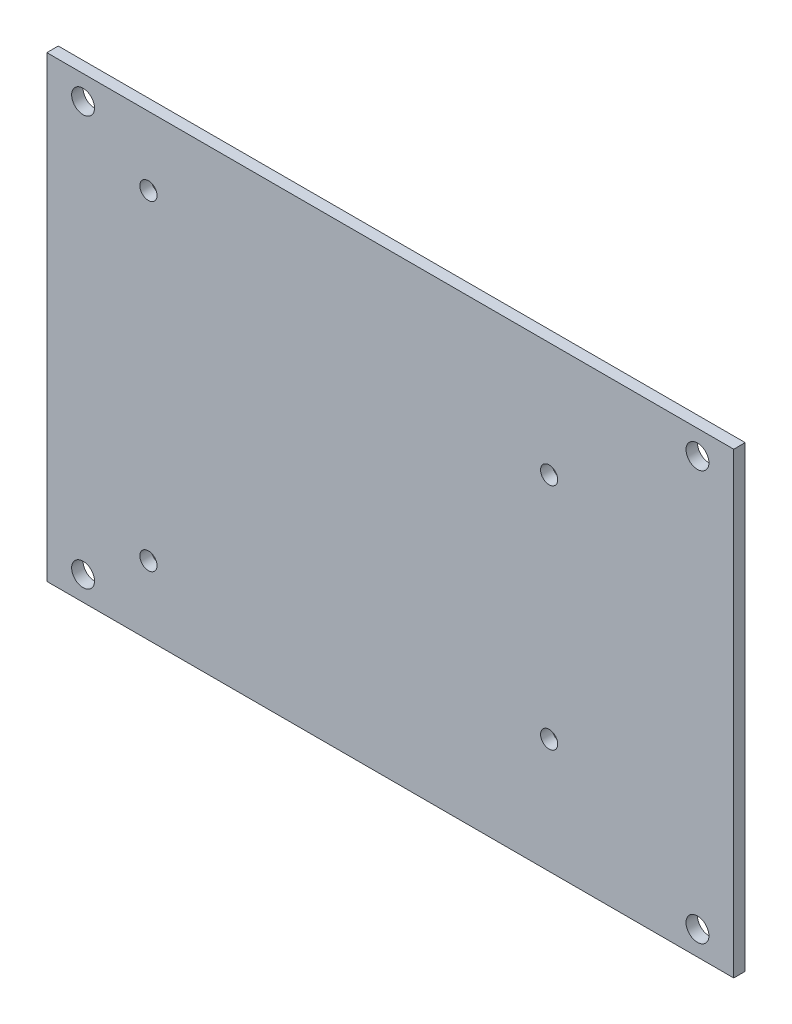
ISO-10303-21;
HEADER;
FILE_DESCRIPTION(('STEP AP214'),'2;1');
FILE_NAME('part.step','',(''),(''),'','','');
FILE_SCHEMA(('AUTOMOTIVE_DESIGN { 1 0 10303 214 1 1 1 1 }'));
ENDSEC;
DATA;
#1=APPLICATION_CONTEXT('core data for automotive mechanical design processes');
#2=APPLICATION_PROTOCOL_DEFINITION('international standard','automotive_design',2000,#1);
#3=PRODUCT_CONTEXT('',#1,'mechanical');
#4=PRODUCT('Part','Part','',(#3));
#5=PRODUCT_RELATED_PRODUCT_CATEGORY('part','',(#4));
#6=PRODUCT_DEFINITION_FORMATION('','',#4);
#7=PRODUCT_DEFINITION_CONTEXT('part definition',#1,'design');
#8=PRODUCT_DEFINITION('design','',#6,#7);
#9=PRODUCT_DEFINITION_SHAPE('','',#8);
#10=(LENGTH_UNIT() NAMED_UNIT(*) SI_UNIT(.MILLI.,.METRE.));
#11=(NAMED_UNIT(*) PLANE_ANGLE_UNIT() SI_UNIT($,.RADIAN.));
#12=(NAMED_UNIT(*) SI_UNIT($,.STERADIAN.) SOLID_ANGLE_UNIT());
#13=UNCERTAINTY_MEASURE_WITH_UNIT(LENGTH_MEASURE(1.E-05),#10,'distance_accuracy_value','');
#14=(GEOMETRIC_REPRESENTATION_CONTEXT(3) GLOBAL_UNCERTAINTY_ASSIGNED_CONTEXT((#13)) GLOBAL_UNIT_ASSIGNED_CONTEXT((#10,
#11,#12)) REPRESENTATION_CONTEXT('',''));
#15=CARTESIAN_POINT('',(0.,0.,0.));
#16=DIRECTION('',(0.,0.,1.));
#17=DIRECTION('',(1.,0.,0.));
#18=AXIS2_PLACEMENT_3D('',#15,#16,#17);
#19=CARTESIAN_POINT('',(0.,0.,2.));
#20=DIRECTION('',(0.,0.,1.));
#21=DIRECTION('',(1.,0.,0.));
#22=AXIS2_PLACEMENT_3D('',#19,#20,#21);
#23=PLANE('',#22);
#24=CARTESIAN_POINT('',(53.6640762666579,-35.7760508444386,2.));
#25=DIRECTION('',(0.,0.,1.));
#26=DIRECTION('',(1.,0.,0.));
#27=AXIS2_PLACEMENT_3D('',#24,#25,#26);
#28=CIRCLE('',#27,2.);
#29=CARTESIAN_POINT('',(55.6640762666579,-35.7760508444386,2.));
#30=VERTEX_POINT('',#29);
#31=EDGE_CURVE('E144',#30,#30,#28,.T.);
#32=ORIENTED_EDGE('',*,*,#31,.F.);
#33=EDGE_LOOP('',(#32));
#34=FACE_BOUND('',#33,.T.);
#35=CARTESIAN_POINT('',(-42.25,-28.,2.));
#36=DIRECTION('',(0.,0.,1.));
#37=DIRECTION('',(-1.,0.,0.));
#38=AXIS2_PLACEMENT_3D('',#35,#36,#37);
#39=CIRCLE('',#38,1.5);
#40=CARTESIAN_POINT('',(-43.75,-28.,2.));
#41=VERTEX_POINT('',#40);
#42=EDGE_CURVE('E132',#41,#41,#39,.T.);
#43=ORIENTED_EDGE('',*,*,#42,.F.);
#44=EDGE_LOOP('',(#43));
#45=FACE_BOUND('',#44,.T.);
#46=CARTESIAN_POINT('',(27.75,20.,2.));
#47=DIRECTION('',(0.,0.,1.));
#48=DIRECTION('',(1.,0.,0.));
#49=AXIS2_PLACEMENT_3D('',#46,#47,#48);
#50=CIRCLE('',#49,1.5);
#51=CARTESIAN_POINT('',(29.25,20.,2.));
#52=VERTEX_POINT('',#51);
#53=EDGE_CURVE('E120',#52,#52,#50,.T.);
#54=ORIENTED_EDGE('',*,*,#53,.F.);
#55=EDGE_LOOP('',(#54));
#56=FACE_BOUND('',#55,.T.);
#57=CARTESIAN_POINT('',(-53.6640762666579,35.7760508444386,2.));
#58=DIRECTION('',(0.,0.,1.));
#59=DIRECTION('',(1.,0.,0.));
#60=AXIS2_PLACEMENT_3D('',#57,#58,#59);
#61=CIRCLE('',#60,2.);
#62=CARTESIAN_POINT('',(-51.6640762666579,35.7760508444386,2.));
#63=VERTEX_POINT('',#62);
#64=EDGE_CURVE('E99',#63,#63,#61,.T.);
#65=ORIENTED_EDGE('',*,*,#64,.F.);
#66=EDGE_LOOP('',(#65));
#67=FACE_BOUND('',#66,.T.);
#68=DIRECTION('',(0.,1.,0.));
#69=VECTOR('',#68,1.);
#70=CARTESIAN_POINT('',(60.,40.,2.));
#71=LINE('',#70,#69);
#72=CARTESIAN_POINT('',(60.,-40.,2.));
#73=VERTEX_POINT('',#72);
#74=CARTESIAN_POINT('',(60.,40.,2.));
#75=VERTEX_POINT('',#74);
#76=EDGE_CURVE('E84',#73,#75,#71,.T.);
#77=ORIENTED_EDGE('',*,*,#76,.T.);
#78=DIRECTION('',(-1.,0.,0.));
#79=VECTOR('',#78,1.);
#80=CARTESIAN_POINT('',(-60.,40.,2.));
#81=LINE('',#80,#79);
#82=CARTESIAN_POINT('',(-60.,40.,2.));
#83=VERTEX_POINT('',#82);
#84=EDGE_CURVE('E79',#75,#83,#81,.T.);
#85=ORIENTED_EDGE('',*,*,#84,.T.);
#86=DIRECTION('',(0.,-1.,0.));
#87=VECTOR('',#86,1.);
#88=CARTESIAN_POINT('',(-60.,40.,2.));
#89=LINE('',#88,#87);
#90=CARTESIAN_POINT('',(-60.,-40.,2.));
#91=VERTEX_POINT('',#90);
#92=EDGE_CURVE('E82',#83,#91,#89,.T.);
#93=ORIENTED_EDGE('',*,*,#92,.T.);
#94=DIRECTION('',(1.,0.,0.));
#95=VECTOR('',#94,1.);
#96=CARTESIAN_POINT('',(-60.,-40.,2.));
#97=LINE('',#96,#95);
#98=EDGE_CURVE('E49',#91,#73,#97,.T.);
#99=ORIENTED_EDGE('',*,*,#98,.T.);
#100=EDGE_LOOP('',(#77,#85,#93,#99));
#101=FACE_BOUND('',#100,.T.);
#102=CARTESIAN_POINT('',(-42.25,28.,2.));
#103=DIRECTION('',(0.,0.,1.));
#104=DIRECTION('',(1.,0.,0.));
#105=AXIS2_PLACEMENT_3D('',#102,#103,#104);
#106=CIRCLE('',#105,1.5);
#107=CARTESIAN_POINT('',(-40.75,28.,2.));
#108=VERTEX_POINT('',#107);
#109=EDGE_CURVE('E114',#108,#108,#106,.T.);
#110=ORIENTED_EDGE('',*,*,#109,.F.);
#111=EDGE_LOOP('',(#110));
#112=FACE_BOUND('',#111,.T.);
#113=CARTESIAN_POINT('',(27.75,-20.,2.));
#114=DIRECTION('',(0.,0.,1.));
#115=DIRECTION('',(-1.,0.,0.));
#116=AXIS2_PLACEMENT_3D('',#113,#114,#115);
#117=CIRCLE('',#116,1.5);
#118=CARTESIAN_POINT('',(26.25,-20.,2.));
#119=VERTEX_POINT('',#118);
#120=EDGE_CURVE('E126',#119,#119,#117,.T.);
#121=ORIENTED_EDGE('',*,*,#120,.F.);
#122=EDGE_LOOP('',(#121));
#123=FACE_BOUND('',#122,.T.);
#124=CARTESIAN_POINT('',(53.6640762666579,35.7760508444386,2.));
#125=DIRECTION('',(0.,0.,1.));
#126=DIRECTION('',(-1.,0.,0.));
#127=AXIS2_PLACEMENT_3D('',#124,#125,#126);
#128=CIRCLE('',#127,2.);
#129=CARTESIAN_POINT('',(51.6640762666579,35.7760508444386,2.));
#130=VERTEX_POINT('',#129);
#131=EDGE_CURVE('E138',#130,#130,#128,.T.);
#132=ORIENTED_EDGE('',*,*,#131,.F.);
#133=EDGE_LOOP('',(#132));
#134=FACE_BOUND('',#133,.T.);
#135=CARTESIAN_POINT('',(-53.6640762666579,-35.7760508444386,2.));
#136=DIRECTION('',(0.,0.,1.));
#137=DIRECTION('',(-1.,0.,0.));
#138=AXIS2_PLACEMENT_3D('',#135,#136,#137);
#139=CIRCLE('',#138,2.);
#140=CARTESIAN_POINT('',(-55.6640762666579,-35.7760508444386,2.));
#141=VERTEX_POINT('',#140);
#142=EDGE_CURVE('E150',#141,#141,#139,.T.);
#143=ORIENTED_EDGE('',*,*,#142,.F.);
#144=EDGE_LOOP('',(#143));
#145=FACE_BOUND('',#144,.T.);
#146=ADVANCED_FACE('F32',(#34,#45,#56,#67,#101,#112,#123,#134,#145),#23,.T.);
#147=CARTESIAN_POINT('',(0.,0.,0.));
#148=DIRECTION('',(0.,0.,1.));
#149=DIRECTION('',(1.,0.,0.));
#150=AXIS2_PLACEMENT_3D('',#147,#148,#149);
#151=PLANE('',#150);
#152=DIRECTION('',(0.,1.,0.));
#153=VECTOR('',#152,1.);
#154=CARTESIAN_POINT('',(60.,40.,0.));
#155=LINE('',#154,#153);
#156=CARTESIAN_POINT('',(60.,-40.,0.));
#157=VERTEX_POINT('',#156);
#158=CARTESIAN_POINT('',(60.,40.,0.));
#159=VERTEX_POINT('',#158);
#160=EDGE_CURVE('E96',#157,#159,#155,.T.);
#161=ORIENTED_EDGE('',*,*,#160,.F.);
#162=DIRECTION('',(1.,0.,0.));
#163=VECTOR('',#162,1.);
#164=CARTESIAN_POINT('',(-60.,-40.,0.));
#165=LINE('',#164,#163);
#166=CARTESIAN_POINT('',(-60.,-40.,0.));
#167=VERTEX_POINT('',#166);
#168=EDGE_CURVE('E72',#167,#157,#165,.T.);
#169=ORIENTED_EDGE('',*,*,#168,.F.);
#170=DIRECTION('',(0.,-1.,0.));
#171=VECTOR('',#170,1.);
#172=CARTESIAN_POINT('',(-60.,40.,0.));
#173=LINE('',#172,#171);
#174=CARTESIAN_POINT('',(-60.,40.,0.));
#175=VERTEX_POINT('',#174);
#176=EDGE_CURVE('E66',#175,#167,#173,.T.);
#177=ORIENTED_EDGE('',*,*,#176,.F.);
#178=DIRECTION('',(-1.,0.,0.));
#179=VECTOR('',#178,1.);
#180=CARTESIAN_POINT('',(-60.,40.,0.));
#181=LINE('',#180,#179);
#182=EDGE_CURVE('E88',#159,#175,#181,.T.);
#183=ORIENTED_EDGE('',*,*,#182,.F.);
#184=EDGE_LOOP('',(#161,#169,#177,#183));
#185=FACE_BOUND('',#184,.T.);
#186=CARTESIAN_POINT('',(-53.6640762666579,35.7760508444386,0.));
#187=DIRECTION('',(0.,0.,1.));
#188=DIRECTION('',(1.,0.,0.));
#189=AXIS2_PLACEMENT_3D('',#186,#187,#188);
#190=CIRCLE('',#189,2.);
#191=CARTESIAN_POINT('',(-51.6640762666579,35.7760508444386,0.));
#192=VERTEX_POINT('',#191);
#193=EDGE_CURVE('E111',#192,#192,#190,.T.);
#194=ORIENTED_EDGE('',*,*,#193,.T.);
#195=EDGE_LOOP('',(#194));
#196=FACE_BOUND('',#195,.T.);
#197=CARTESIAN_POINT('',(-42.25,28.,0.));
#198=DIRECTION('',(0.,0.,1.));
#199=DIRECTION('',(1.,0.,0.));
#200=AXIS2_PLACEMENT_3D('',#197,#198,#199);
#201=CIRCLE('',#200,1.5);
#202=CARTESIAN_POINT('',(-40.75,28.,0.));
#203=VERTEX_POINT('',#202);
#204=EDGE_CURVE('E117',#203,#203,#201,.T.);
#205=ORIENTED_EDGE('',*,*,#204,.T.);
#206=EDGE_LOOP('',(#205));
#207=FACE_BOUND('',#206,.T.);
#208=CARTESIAN_POINT('',(27.75,20.,0.));
#209=DIRECTION('',(0.,0.,1.));
#210=DIRECTION('',(1.,0.,0.));
#211=AXIS2_PLACEMENT_3D('',#208,#209,#210);
#212=CIRCLE('',#211,1.5);
#213=CARTESIAN_POINT('',(29.25,20.,0.));
#214=VERTEX_POINT('',#213);
#215=EDGE_CURVE('E123',#214,#214,#212,.T.);
#216=ORIENTED_EDGE('',*,*,#215,.T.);
#217=EDGE_LOOP('',(#216));
#218=FACE_BOUND('',#217,.T.);
#219=CARTESIAN_POINT('',(27.75,-20.,0.));
#220=DIRECTION('',(0.,0.,1.));
#221=DIRECTION('',(-1.,0.,0.));
#222=AXIS2_PLACEMENT_3D('',#219,#220,#221);
#223=CIRCLE('',#222,1.5);
#224=CARTESIAN_POINT('',(26.25,-20.,0.));
#225=VERTEX_POINT('',#224);
#226=EDGE_CURVE('E129',#225,#225,#223,.T.);
#227=ORIENTED_EDGE('',*,*,#226,.T.);
#228=EDGE_LOOP('',(#227));
#229=FACE_BOUND('',#228,.T.);
#230=CARTESIAN_POINT('',(-42.25,-28.,0.));
#231=DIRECTION('',(0.,0.,1.));
#232=DIRECTION('',(-1.,0.,0.));
#233=AXIS2_PLACEMENT_3D('',#230,#231,#232);
#234=CIRCLE('',#233,1.5);
#235=CARTESIAN_POINT('',(-43.75,-28.,0.));
#236=VERTEX_POINT('',#235);
#237=EDGE_CURVE('E135',#236,#236,#234,.T.);
#238=ORIENTED_EDGE('',*,*,#237,.T.);
#239=EDGE_LOOP('',(#238));
#240=FACE_BOUND('',#239,.T.);
#241=CARTESIAN_POINT('',(53.6640762666579,35.7760508444386,0.));
#242=DIRECTION('',(0.,0.,1.));
#243=DIRECTION('',(-1.,0.,0.));
#244=AXIS2_PLACEMENT_3D('',#241,#242,#243);
#245=CIRCLE('',#244,2.);
#246=CARTESIAN_POINT('',(51.6640762666579,35.7760508444386,0.));
#247=VERTEX_POINT('',#246);
#248=EDGE_CURVE('E141',#247,#247,#245,.T.);
#249=ORIENTED_EDGE('',*,*,#248,.T.);
#250=EDGE_LOOP('',(#249));
#251=FACE_BOUND('',#250,.T.);
#252=CARTESIAN_POINT('',(53.6640762666579,-35.7760508444386,0.));
#253=DIRECTION('',(0.,0.,1.));
#254=DIRECTION('',(1.,0.,0.));
#255=AXIS2_PLACEMENT_3D('',#252,#253,#254);
#256=CIRCLE('',#255,2.);
#257=CARTESIAN_POINT('',(55.6640762666579,-35.7760508444386,0.));
#258=VERTEX_POINT('',#257);
#259=EDGE_CURVE('E147',#258,#258,#256,.T.);
#260=ORIENTED_EDGE('',*,*,#259,.T.);
#261=EDGE_LOOP('',(#260));
#262=FACE_BOUND('',#261,.T.);
#263=CARTESIAN_POINT('',(-53.6640762666579,-35.7760508444386,0.));
#264=DIRECTION('',(0.,0.,1.));
#265=DIRECTION('',(-1.,0.,0.));
#266=AXIS2_PLACEMENT_3D('',#263,#264,#265);
#267=CIRCLE('',#266,2.);
#268=CARTESIAN_POINT('',(-55.6640762666579,-35.7760508444386,0.));
#269=VERTEX_POINT('',#268);
#270=EDGE_CURVE('E153',#269,#269,#267,.T.);
#271=ORIENTED_EDGE('',*,*,#270,.T.);
#272=EDGE_LOOP('',(#271));
#273=FACE_BOUND('',#272,.T.);
#274=ADVANCED_FACE('F107',(#185,#196,#207,#218,#229,#240,#251,#262,#273),#151,.F.);
#275=CARTESIAN_POINT('',(60.,40.,2.));
#276=DIRECTION('',(-1.,0.,0.));
#277=DIRECTION('',(0.,-1.,0.));
#278=AXIS2_PLACEMENT_3D('',#275,#276,#277);
#279=PLANE('',#278);
#280=ORIENTED_EDGE('',*,*,#160,.T.);
#281=DIRECTION('',(0.,0.,-1.));
#282=VECTOR('',#281,1.);
#283=CARTESIAN_POINT('',(60.,40.,2.));
#284=LINE('',#283,#282);
#285=EDGE_CURVE('E11',#75,#159,#284,.T.);
#286=ORIENTED_EDGE('',*,*,#285,.F.);
#287=ORIENTED_EDGE('',*,*,#76,.F.);
#288=DIRECTION('',(0.,0.,-1.));
#289=VECTOR('',#288,1.);
#290=CARTESIAN_POINT('',(60.,-40.,2.));
#291=LINE('',#290,#289);
#292=EDGE_CURVE('E92',#73,#157,#291,.T.);
#293=ORIENTED_EDGE('',*,*,#292,.T.);
#294=EDGE_LOOP('',(#280,#286,#287,#293));
#295=FACE_BOUND('',#294,.T.);
#296=ADVANCED_FACE('F34',(#295),#279,.F.);
#297=CARTESIAN_POINT('',(-60.,40.,2.));
#298=DIRECTION('',(0.,-1.,0.));
#299=DIRECTION('',(0.,0.,-1.));
#300=AXIS2_PLACEMENT_3D('',#297,#298,#299);
#301=PLANE('',#300);
#302=ORIENTED_EDGE('',*,*,#182,.T.);
#303=DIRECTION('',(0.,0.,-1.));
#304=VECTOR('',#303,1.);
#305=CARTESIAN_POINT('',(-60.,40.,2.));
#306=LINE('',#305,#304);
#307=EDGE_CURVE('E41',#83,#175,#306,.T.);
#308=ORIENTED_EDGE('',*,*,#307,.F.);
#309=ORIENTED_EDGE('',*,*,#84,.F.);
#310=ORIENTED_EDGE('',*,*,#285,.T.);
#311=EDGE_LOOP('',(#302,#308,#309,#310));
#312=FACE_BOUND('',#311,.T.);
#313=ADVANCED_FACE('F87',(#312),#301,.F.);
#314=CARTESIAN_POINT('',(-60.,40.,2.));
#315=DIRECTION('',(1.,0.,0.));
#316=DIRECTION('',(0.,1.,0.));
#317=AXIS2_PLACEMENT_3D('',#314,#315,#316);
#318=PLANE('',#317);
#319=ORIENTED_EDGE('',*,*,#176,.T.);
#320=DIRECTION('',(0.,0.,-1.));
#321=VECTOR('',#320,1.);
#322=CARTESIAN_POINT('',(-60.,-40.,2.));
#323=LINE('',#322,#321);
#324=EDGE_CURVE('E89',#91,#167,#323,.T.);
#325=ORIENTED_EDGE('',*,*,#324,.F.);
#326=ORIENTED_EDGE('',*,*,#92,.F.);
#327=ORIENTED_EDGE('',*,*,#307,.T.);
#328=EDGE_LOOP('',(#319,#325,#326,#327));
#329=FACE_BOUND('',#328,.T.);
#330=ADVANCED_FACE('F90',(#329),#318,.F.);
#331=CARTESIAN_POINT('',(-60.,-40.,2.));
#332=DIRECTION('',(0.,1.,0.));
#333=DIRECTION('',(0.,0.,1.));
#334=AXIS2_PLACEMENT_3D('',#331,#332,#333);
#335=PLANE('',#334);
#336=ORIENTED_EDGE('',*,*,#168,.T.);
#337=ORIENTED_EDGE('',*,*,#292,.F.);
#338=ORIENTED_EDGE('',*,*,#98,.F.);
#339=ORIENTED_EDGE('',*,*,#324,.T.);
#340=EDGE_LOOP('',(#336,#337,#338,#339));
#341=FACE_BOUND('',#340,.T.);
#342=ADVANCED_FACE('F104',(#341),#335,.F.);
#343=CARTESIAN_POINT('',(-53.6640762666579,35.7760508444386,2.));
#344=DIRECTION('',(0.,0.,-1.));
#345=DIRECTION('',(-1.,0.,0.));
#346=AXIS2_PLACEMENT_3D('',#343,#344,#345);
#347=CYLINDRICAL_SURFACE('',#346,2.);
#348=ORIENTED_EDGE('',*,*,#64,.T.);
#349=EDGE_LOOP('',(#348));
#350=FACE_BOUND('',#349,.T.);
#351=ORIENTED_EDGE('',*,*,#193,.F.);
#352=EDGE_LOOP('',(#351));
#353=FACE_BOUND('',#352,.T.);
#354=ADVANCED_FACE('F172',(#350,#353),#347,.F.);
#355=CARTESIAN_POINT('',(-42.25,28.,2.));
#356=DIRECTION('',(0.,0.,-1.));
#357=DIRECTION('',(-1.,0.,0.));
#358=AXIS2_PLACEMENT_3D('',#355,#356,#357);
#359=CYLINDRICAL_SURFACE('',#358,1.5);
#360=ORIENTED_EDGE('',*,*,#109,.T.);
#361=EDGE_LOOP('',(#360));
#362=FACE_BOUND('',#361,.T.);
#363=ORIENTED_EDGE('',*,*,#204,.F.);
#364=EDGE_LOOP('',(#363));
#365=FACE_BOUND('',#364,.T.);
#366=ADVANCED_FACE('F218',(#362,#365),#359,.F.);
#367=CARTESIAN_POINT('',(27.75,20.,2.));
#368=DIRECTION('',(0.,0.,-1.));
#369=DIRECTION('',(-1.,0.,0.));
#370=AXIS2_PLACEMENT_3D('',#367,#368,#369);
#371=CYLINDRICAL_SURFACE('',#370,1.5);
#372=ORIENTED_EDGE('',*,*,#53,.T.);
#373=EDGE_LOOP('',(#372));
#374=FACE_BOUND('',#373,.T.);
#375=ORIENTED_EDGE('',*,*,#215,.F.);
#376=EDGE_LOOP('',(#375));
#377=FACE_BOUND('',#376,.T.);
#378=ADVANCED_FACE('F226',(#374,#377),#371,.F.);
#379=CARTESIAN_POINT('',(27.75,-20.,2.));
#380=DIRECTION('',(0.,0.,-1.));
#381=DIRECTION('',(-1.,0.,0.));
#382=AXIS2_PLACEMENT_3D('',#379,#380,#381);
#383=CYLINDRICAL_SURFACE('',#382,1.5);
#384=ORIENTED_EDGE('',*,*,#120,.T.);
#385=EDGE_LOOP('',(#384));
#386=FACE_BOUND('',#385,.T.);
#387=ORIENTED_EDGE('',*,*,#226,.F.);
#388=EDGE_LOOP('',(#387));
#389=FACE_BOUND('',#388,.T.);
#390=ADVANCED_FACE('F234',(#386,#389),#383,.F.);
#391=CARTESIAN_POINT('',(-42.25,-28.,2.));
#392=DIRECTION('',(0.,0.,-1.));
#393=DIRECTION('',(-1.,0.,0.));
#394=AXIS2_PLACEMENT_3D('',#391,#392,#393);
#395=CYLINDRICAL_SURFACE('',#394,1.5);
#396=ORIENTED_EDGE('',*,*,#42,.T.);
#397=EDGE_LOOP('',(#396));
#398=FACE_BOUND('',#397,.T.);
#399=ORIENTED_EDGE('',*,*,#237,.F.);
#400=EDGE_LOOP('',(#399));
#401=FACE_BOUND('',#400,.T.);
#402=ADVANCED_FACE('F243',(#398,#401),#395,.F.);
#403=CARTESIAN_POINT('',(53.6640762666579,35.7760508444386,2.));
#404=DIRECTION('',(0.,0.,-1.));
#405=DIRECTION('',(-1.,0.,0.));
#406=AXIS2_PLACEMENT_3D('',#403,#404,#405);
#407=CYLINDRICAL_SURFACE('',#406,2.);
#408=ORIENTED_EDGE('',*,*,#131,.T.);
#409=EDGE_LOOP('',(#408));
#410=FACE_BOUND('',#409,.T.);
#411=ORIENTED_EDGE('',*,*,#248,.F.);
#412=EDGE_LOOP('',(#411));
#413=FACE_BOUND('',#412,.T.);
#414=ADVANCED_FACE('F252',(#410,#413),#407,.F.);
#415=CARTESIAN_POINT('',(53.6640762666579,-35.7760508444386,2.));
#416=DIRECTION('',(0.,0.,-1.));
#417=DIRECTION('',(-1.,0.,0.));
#418=AXIS2_PLACEMENT_3D('',#415,#416,#417);
#419=CYLINDRICAL_SURFACE('',#418,2.);
#420=ORIENTED_EDGE('',*,*,#31,.T.);
#421=EDGE_LOOP('',(#420));
#422=FACE_BOUND('',#421,.T.);
#423=ORIENTED_EDGE('',*,*,#259,.F.);
#424=EDGE_LOOP('',(#423));
#425=FACE_BOUND('',#424,.T.);
#426=ADVANCED_FACE('F261',(#422,#425),#419,.F.);
#427=CARTESIAN_POINT('',(-53.6640762666579,-35.7760508444386,2.));
#428=DIRECTION('',(0.,0.,-1.));
#429=DIRECTION('',(-1.,0.,0.));
#430=AXIS2_PLACEMENT_3D('',#427,#428,#429);
#431=CYLINDRICAL_SURFACE('',#430,2.);
#432=ORIENTED_EDGE('',*,*,#142,.T.);
#433=EDGE_LOOP('',(#432));
#434=FACE_BOUND('',#433,.T.);
#435=ORIENTED_EDGE('',*,*,#270,.F.);
#436=EDGE_LOOP('',(#435));
#437=FACE_BOUND('',#436,.T.);
#438=ADVANCED_FACE('F159',(#434,#437),#431,.F.);
#439=CLOSED_SHELL('',(#146,#274,#296,#313,#330,#342,#354,#366,#378,#390,#402,#414,#426,#438));
#440=MANIFOLD_SOLID_BREP('B2',#439);
#441=ADVANCED_BREP_SHAPE_REPRESENTATION('',(#18,#440),#14);
#442=SHAPE_DEFINITION_REPRESENTATION(#9,#441);
ENDSEC;
END-ISO-10303-21;
